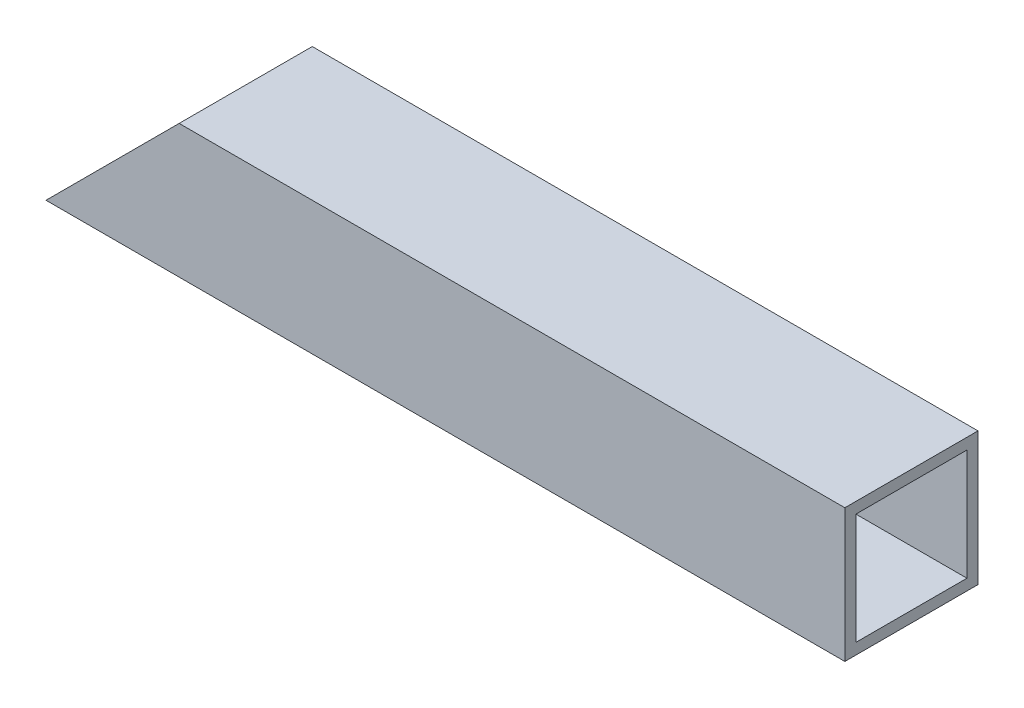
ISO-10303-21;
HEADER;
FILE_DESCRIPTION(('STEP AP214'),'2;1');
FILE_NAME('part.step','',(''),(''),'','','');
FILE_SCHEMA(('AUTOMOTIVE_DESIGN { 1 0 10303 214 1 1 1 1 }'));
ENDSEC;
DATA;
#1=APPLICATION_CONTEXT('core data for automotive mechanical design processes');
#2=APPLICATION_PROTOCOL_DEFINITION('international standard','automotive_design',2000,#1);
#3=PRODUCT_CONTEXT('',#1,'mechanical');
#4=PRODUCT('Part','Part','',(#3));
#5=PRODUCT_RELATED_PRODUCT_CATEGORY('part','',(#4));
#6=PRODUCT_DEFINITION_FORMATION('','',#4);
#7=PRODUCT_DEFINITION_CONTEXT('part definition',#1,'design');
#8=PRODUCT_DEFINITION('design','',#6,#7);
#9=PRODUCT_DEFINITION_SHAPE('','',#8);
#10=(LENGTH_UNIT() NAMED_UNIT(*) SI_UNIT(.MILLI.,.METRE.));
#11=(NAMED_UNIT(*) PLANE_ANGLE_UNIT() SI_UNIT($,.RADIAN.));
#12=(NAMED_UNIT(*) SI_UNIT($,.STERADIAN.) SOLID_ANGLE_UNIT());
#13=UNCERTAINTY_MEASURE_WITH_UNIT(LENGTH_MEASURE(1.E-05),#10,'distance_accuracy_value','');
#14=(GEOMETRIC_REPRESENTATION_CONTEXT(3) GLOBAL_UNCERTAINTY_ASSIGNED_CONTEXT((#13)) GLOBAL_UNIT_ASSIGNED_CONTEXT((#10,
#11,#12)) REPRESENTATION_CONTEXT('',''));
#15=CARTESIAN_POINT('',(0.,0.,0.));
#16=DIRECTION('',(0.,0.,1.));
#17=DIRECTION('',(1.,0.,0.));
#18=AXIS2_PLACEMENT_3D('',#15,#16,#17);
#19=CARTESIAN_POINT('',(152.4,12.7,12.7));
#20=DIRECTION('',(0.,-1.,0.));
#21=DIRECTION('',(0.,0.,-1.));
#22=AXIS2_PLACEMENT_3D('',#19,#20,#21);
#23=PLANE('',#22);
#24=DIRECTION('',(-1.,0.,0.));
#25=VECTOR('',#24,1.);
#26=CARTESIAN_POINT('',(152.4,12.7,-12.7));
#27=LINE('',#26,#25);
#28=CARTESIAN_POINT('',(152.4,12.7,-12.7));
#29=VERTEX_POINT('',#28);
#30=CARTESIAN_POINT('',(25.3999999999997,12.7,-12.7));
#31=VERTEX_POINT('',#30);
#32=EDGE_CURVE('E146',#29,#31,#27,.T.);
#33=ORIENTED_EDGE('',*,*,#32,.T.);
#34=DIRECTION('',(0.,0.,1.));
#35=VECTOR('',#34,1.);
#36=CARTESIAN_POINT('',(25.3999999999997,12.7,-46.228));
#37=LINE('',#36,#35);
#38=CARTESIAN_POINT('',(25.3999999999997,12.7,12.7));
#39=VERTEX_POINT('',#38);
#40=EDGE_CURVE('E186',#31,#39,#37,.T.);
#41=ORIENTED_EDGE('',*,*,#40,.T.);
#42=DIRECTION('',(-1.,0.,0.));
#43=VECTOR('',#42,1.);
#44=CARTESIAN_POINT('',(152.4,12.7,12.7));
#45=LINE('',#44,#43);
#46=CARTESIAN_POINT('',(152.4,12.7,12.7));
#47=VERTEX_POINT('',#46);
#48=EDGE_CURVE('E12',#47,#39,#45,.T.);
#49=ORIENTED_EDGE('',*,*,#48,.F.);
#50=DIRECTION('',(0.,0.,1.));
#51=VECTOR('',#50,1.);
#52=CARTESIAN_POINT('',(152.4,12.7,12.7));
#53=LINE('',#52,#51);
#54=EDGE_CURVE('E123',#29,#47,#53,.T.);
#55=ORIENTED_EDGE('',*,*,#54,.F.);
#56=EDGE_LOOP('',(#33,#41,#49,#55));
#57=FACE_BOUND('',#56,.T.);
#58=ADVANCED_FACE('F52',(#57),#23,.F.);
#59=CARTESIAN_POINT('',(152.4,12.7,12.7));
#60=DIRECTION('',(0.,0.,-1.));
#61=DIRECTION('',(-1.,0.,0.));
#62=AXIS2_PLACEMENT_3D('',#59,#60,#61);
#63=PLANE('',#62);
#64=ORIENTED_EDGE('',*,*,#48,.T.);
#65=DIRECTION('',(0.707106781186543,0.707106781186551,0.));
#66=VECTOR('',#65,1.);
#67=CARTESIAN_POINT('',(0.,-12.7,12.7));
#68=LINE('',#67,#66);
#69=CARTESIAN_POINT('',(0.,-12.7,12.7));
#70=VERTEX_POINT('',#69);
#71=EDGE_CURVE('E132',#70,#39,#68,.T.);
#72=ORIENTED_EDGE('',*,*,#71,.F.);
#73=DIRECTION('',(-1.,0.,0.));
#74=VECTOR('',#73,1.);
#75=CARTESIAN_POINT('',(152.4,-12.7,12.7));
#76=LINE('',#75,#74);
#77=CARTESIAN_POINT('',(152.4,-12.7,12.7));
#78=VERTEX_POINT('',#77);
#79=EDGE_CURVE('E61',#78,#70,#76,.T.);
#80=ORIENTED_EDGE('',*,*,#79,.F.);
#81=DIRECTION('',(0.,-1.,0.));
#82=VECTOR('',#81,1.);
#83=CARTESIAN_POINT('',(152.4,12.7,12.7));
#84=LINE('',#83,#82);
#85=EDGE_CURVE('E116',#47,#78,#84,.T.);
#86=ORIENTED_EDGE('',*,*,#85,.F.);
#87=EDGE_LOOP('',(#64,#72,#80,#86));
#88=FACE_BOUND('',#87,.T.);
#89=ADVANCED_FACE('F129',(#88),#63,.F.);
#90=CARTESIAN_POINT('',(152.4,-12.7,-12.7));
#91=DIRECTION('',(0.,1.,0.));
#92=DIRECTION('',(0.,0.,1.));
#93=AXIS2_PLACEMENT_3D('',#90,#91,#92);
#94=PLANE('',#93);
#95=DIRECTION('',(0.,0.,-1.));
#96=VECTOR('',#95,1.);
#97=CARTESIAN_POINT('',(0.,-12.7,-12.7));
#98=LINE('',#97,#96);
#99=CARTESIAN_POINT('',(0.,-12.7,-12.7));
#100=VERTEX_POINT('',#99);
#101=EDGE_CURVE('E143',#70,#100,#98,.T.);
#102=ORIENTED_EDGE('',*,*,#101,.T.);
#103=DIRECTION('',(-1.,0.,0.));
#104=VECTOR('',#103,1.);
#105=CARTESIAN_POINT('',(152.4,-12.7,-12.7));
#106=LINE('',#105,#104);
#107=CARTESIAN_POINT('',(152.4,-12.7,-12.7));
#108=VERTEX_POINT('',#107);
#109=EDGE_CURVE('E134',#108,#100,#106,.T.);
#110=ORIENTED_EDGE('',*,*,#109,.F.);
#111=DIRECTION('',(0.,0.,-1.));
#112=VECTOR('',#111,1.);
#113=CARTESIAN_POINT('',(152.4,-12.7,-12.7));
#114=LINE('',#113,#112);
#115=EDGE_CURVE('E120',#78,#108,#114,.T.);
#116=ORIENTED_EDGE('',*,*,#115,.F.);
#117=ORIENTED_EDGE('',*,*,#79,.T.);
#118=EDGE_LOOP('',(#102,#110,#116,#117));
#119=FACE_BOUND('',#118,.T.);
#120=ADVANCED_FACE('F136',(#119),#94,.F.);
#121=CARTESIAN_POINT('',(152.4,10.5918,10.5918));
#122=DIRECTION('',(0.,0.,-1.));
#123=DIRECTION('',(-1.,0.,0.));
#124=AXIS2_PLACEMENT_3D('',#121,#122,#123);
#125=PLANE('',#124);
#126=DIRECTION('',(-0.707106781186544,-0.707106781186552,0.));
#127=VECTOR('',#126,1.);
#128=CARTESIAN_POINT('',(87.8458999999991,75.1459000000001,10.5918));
#129=LINE('',#128,#127);
#130=CARTESIAN_POINT('',(23.2917999999997,10.5918,10.5918));
#131=VERTEX_POINT('',#130);
#132=CARTESIAN_POINT('',(2.10820000000003,-10.5918,10.5918));
#133=VERTEX_POINT('',#132);
#134=EDGE_CURVE('E69',#131,#133,#129,.T.);
#135=ORIENTED_EDGE('',*,*,#134,.F.);
#136=DIRECTION('',(-1.,0.,0.));
#137=VECTOR('',#136,1.);
#138=CARTESIAN_POINT('',(152.4,10.5918,10.5918));
#139=LINE('',#138,#137);
#140=CARTESIAN_POINT('',(152.4,10.5918,10.5918));
#141=VERTEX_POINT('',#140);
#142=EDGE_CURVE('E56',#141,#131,#139,.T.);
#143=ORIENTED_EDGE('',*,*,#142,.F.);
#144=DIRECTION('',(0.,-1.,0.));
#145=VECTOR('',#144,1.);
#146=CARTESIAN_POINT('',(152.4,10.5918,10.5918));
#147=LINE('',#146,#145);
#148=CARTESIAN_POINT('',(152.4,-10.5918,10.5918));
#149=VERTEX_POINT('',#148);
#150=EDGE_CURVE('E145',#141,#149,#147,.T.);
#151=ORIENTED_EDGE('',*,*,#150,.T.);
#152=DIRECTION('',(-1.,0.,0.));
#153=VECTOR('',#152,1.);
#154=CARTESIAN_POINT('',(152.4,-10.5918,10.5918));
#155=LINE('',#154,#153);
#156=EDGE_CURVE('E139',#149,#133,#155,.T.);
#157=ORIENTED_EDGE('',*,*,#156,.T.);
#158=EDGE_LOOP('',(#135,#143,#151,#157));
#159=FACE_BOUND('',#158,.T.);
#160=ADVANCED_FACE('F54',(#159),#125,.T.);
#161=CARTESIAN_POINT('',(152.4,10.5918,10.5918));
#162=DIRECTION('',(0.,-1.,0.));
#163=DIRECTION('',(0.,0.,-1.));
#164=AXIS2_PLACEMENT_3D('',#161,#162,#163);
#165=PLANE('',#164);
#166=DIRECTION('',(0.,0.,1.));
#167=VECTOR('',#166,1.);
#168=CARTESIAN_POINT('',(23.2917999999997,10.5918,10.5918));
#169=LINE('',#168,#167);
#170=CARTESIAN_POINT('',(23.2917999999997,10.5918,-10.5918));
#171=VERTEX_POINT('',#170);
#172=EDGE_CURVE('E100',#171,#131,#169,.T.);
#173=ORIENTED_EDGE('',*,*,#172,.F.);
#174=DIRECTION('',(-1.,0.,0.));
#175=VECTOR('',#174,1.);
#176=CARTESIAN_POINT('',(152.4,10.5918,-10.5918));
#177=LINE('',#176,#175);
#178=CARTESIAN_POINT('',(152.4,10.5918,-10.5918));
#179=VERTEX_POINT('',#178);
#180=EDGE_CURVE('E154',#179,#171,#177,.T.);
#181=ORIENTED_EDGE('',*,*,#180,.F.);
#182=DIRECTION('',(0.,0.,1.));
#183=VECTOR('',#182,1.);
#184=CARTESIAN_POINT('',(152.4,10.5918,10.5918));
#185=LINE('',#184,#183);
#186=EDGE_CURVE('E164',#179,#141,#185,.T.);
#187=ORIENTED_EDGE('',*,*,#186,.T.);
#188=ORIENTED_EDGE('',*,*,#142,.T.);
#189=EDGE_LOOP('',(#173,#181,#187,#188));
#190=FACE_BOUND('',#189,.T.);
#191=ADVANCED_FACE('F162',(#190),#165,.T.);
#192=CARTESIAN_POINT('',(152.4,-10.5918,-10.5918));
#193=DIRECTION('',(0.,0.,1.));
#194=DIRECTION('',(1.,0.,0.));
#195=AXIS2_PLACEMENT_3D('',#192,#193,#194);
#196=PLANE('',#195);
#197=DIRECTION('',(0.707106781186544,0.707106781186552,0.));
#198=VECTOR('',#197,1.);
#199=CARTESIAN_POINT('',(77.2540999999991,64.5541,-10.5918));
#200=LINE('',#199,#198);
#201=CARTESIAN_POINT('',(2.10819999999998,-10.5918,-10.5918));
#202=VERTEX_POINT('',#201);
#203=EDGE_CURVE('E183',#202,#171,#200,.T.);
#204=ORIENTED_EDGE('',*,*,#203,.F.);
#205=DIRECTION('',(-1.,0.,0.));
#206=VECTOR('',#205,1.);
#207=CARTESIAN_POINT('',(152.4,-10.5918,-10.5918));
#208=LINE('',#207,#206);
#209=CARTESIAN_POINT('',(152.4,-10.5918,-10.5918));
#210=VERTEX_POINT('',#209);
#211=EDGE_CURVE('E152',#210,#202,#208,.T.);
#212=ORIENTED_EDGE('',*,*,#211,.F.);
#213=DIRECTION('',(0.,1.,0.));
#214=VECTOR('',#213,1.);
#215=CARTESIAN_POINT('',(152.4,-10.5918,-10.5918));
#216=LINE('',#215,#214);
#217=EDGE_CURVE('E174',#210,#179,#216,.T.);
#218=ORIENTED_EDGE('',*,*,#217,.T.);
#219=ORIENTED_EDGE('',*,*,#180,.T.);
#220=EDGE_LOOP('',(#204,#212,#218,#219));
#221=FACE_BOUND('',#220,.T.);
#222=ADVANCED_FACE('F206',(#221),#196,.T.);
#223=CARTESIAN_POINT('',(152.4,-10.5918,-10.5918));
#224=DIRECTION('',(0.,1.,0.));
#225=DIRECTION('',(0.,0.,1.));
#226=AXIS2_PLACEMENT_3D('',#223,#224,#225);
#227=PLANE('',#226);
#228=DIRECTION('',(0.,0.,-1.));
#229=VECTOR('',#228,1.);
#230=CARTESIAN_POINT('',(2.10819999999998,-10.5918,-10.5918));
#231=LINE('',#230,#229);
#232=EDGE_CURVE('E182',#133,#202,#231,.T.);
#233=ORIENTED_EDGE('',*,*,#232,.F.);
#234=ORIENTED_EDGE('',*,*,#156,.F.);
#235=DIRECTION('',(0.,0.,-1.));
#236=VECTOR('',#235,1.);
#237=CARTESIAN_POINT('',(152.4,-10.5918,-10.5918));
#238=LINE('',#237,#236);
#239=EDGE_CURVE('E172',#149,#210,#238,.T.);
#240=ORIENTED_EDGE('',*,*,#239,.T.);
#241=ORIENTED_EDGE('',*,*,#211,.T.);
#242=EDGE_LOOP('',(#233,#234,#240,#241));
#243=FACE_BOUND('',#242,.T.);
#244=ADVANCED_FACE('F181',(#243),#227,.T.);
#245=CARTESIAN_POINT('',(152.4,-12.7,-12.7));
#246=DIRECTION('',(0.,0.,1.));
#247=DIRECTION('',(0.,-1.,0.));
#248=AXIS2_PLACEMENT_3D('',#245,#246,#247);
#249=PLANE('',#248);
#250=ORIENTED_EDGE('',*,*,#109,.T.);
#251=DIRECTION('',(0.707106781186544,0.707106781186552,0.));
#252=VECTOR('',#251,1.);
#253=CARTESIAN_POINT('',(76.1999999999992,63.5,-12.7));
#254=LINE('',#253,#252);
#255=EDGE_CURVE('E91',#100,#31,#254,.T.);
#256=ORIENTED_EDGE('',*,*,#255,.T.);
#257=ORIENTED_EDGE('',*,*,#32,.F.);
#258=DIRECTION('',(0.,1.,0.));
#259=VECTOR('',#258,1.);
#260=CARTESIAN_POINT('',(152.4,-12.7,-12.7));
#261=LINE('',#260,#259);
#262=EDGE_CURVE('E78',#108,#29,#261,.T.);
#263=ORIENTED_EDGE('',*,*,#262,.F.);
#264=EDGE_LOOP('',(#250,#256,#257,#263));
#265=FACE_BOUND('',#264,.T.);
#266=ADVANCED_FACE('F198',(#265),#249,.F.);
#267=CARTESIAN_POINT('',(152.4,0.,0.));
#268=DIRECTION('',(1.,0.,0.));
#269=DIRECTION('',(0.,0.,-1.));
#270=AXIS2_PLACEMENT_3D('',#267,#268,#269);
#271=PLANE('',#270);
#272=ORIENTED_EDGE('',*,*,#150,.F.);
#273=ORIENTED_EDGE('',*,*,#186,.F.);
#274=ORIENTED_EDGE('',*,*,#217,.F.);
#275=ORIENTED_EDGE('',*,*,#239,.F.);
#276=EDGE_LOOP('',(#272,#273,#274,#275));
#277=FACE_BOUND('',#276,.T.);
#278=ORIENTED_EDGE('',*,*,#54,.T.);
#279=ORIENTED_EDGE('',*,*,#85,.T.);
#280=ORIENTED_EDGE('',*,*,#115,.T.);
#281=ORIENTED_EDGE('',*,*,#262,.T.);
#282=EDGE_LOOP('',(#278,#279,#280,#281));
#283=FACE_BOUND('',#282,.T.);
#284=ADVANCED_FACE('F118',(#277,#283),#271,.T.);
#285=CARTESIAN_POINT('',(0.,-12.7,-46.228));
#286=DIRECTION('',(0.707106781186552,-0.707106781186544,0.));
#287=DIRECTION('',(0.707106781186544,0.707106781186552,0.));
#288=AXIS2_PLACEMENT_3D('',#285,#286,#287);
#289=PLANE('',#288);
#290=ORIENTED_EDGE('',*,*,#134,.T.);
#291=ORIENTED_EDGE('',*,*,#232,.T.);
#292=ORIENTED_EDGE('',*,*,#203,.T.);
#293=ORIENTED_EDGE('',*,*,#172,.T.);
#294=EDGE_LOOP('',(#290,#291,#292,#293));
#295=FACE_BOUND('',#294,.T.);
#296=ORIENTED_EDGE('',*,*,#101,.F.);
#297=ORIENTED_EDGE('',*,*,#71,.T.);
#298=ORIENTED_EDGE('',*,*,#40,.F.);
#299=ORIENTED_EDGE('',*,*,#255,.F.);
#300=EDGE_LOOP('',(#296,#297,#298,#299));
#301=FACE_BOUND('',#300,.T.);
#302=ADVANCED_FACE('F192',(#295,#301),#289,.F.);
#303=CLOSED_SHELL('',(#58,#89,#120,#160,#191,#222,#244,#266,#284,#302));
#304=MANIFOLD_SOLID_BREP('B2',#303);
#305=ADVANCED_BREP_SHAPE_REPRESENTATION('',(#18,#304),#14);
#306=SHAPE_DEFINITION_REPRESENTATION(#9,#305);
ENDSEC;
END-ISO-10303-21;
